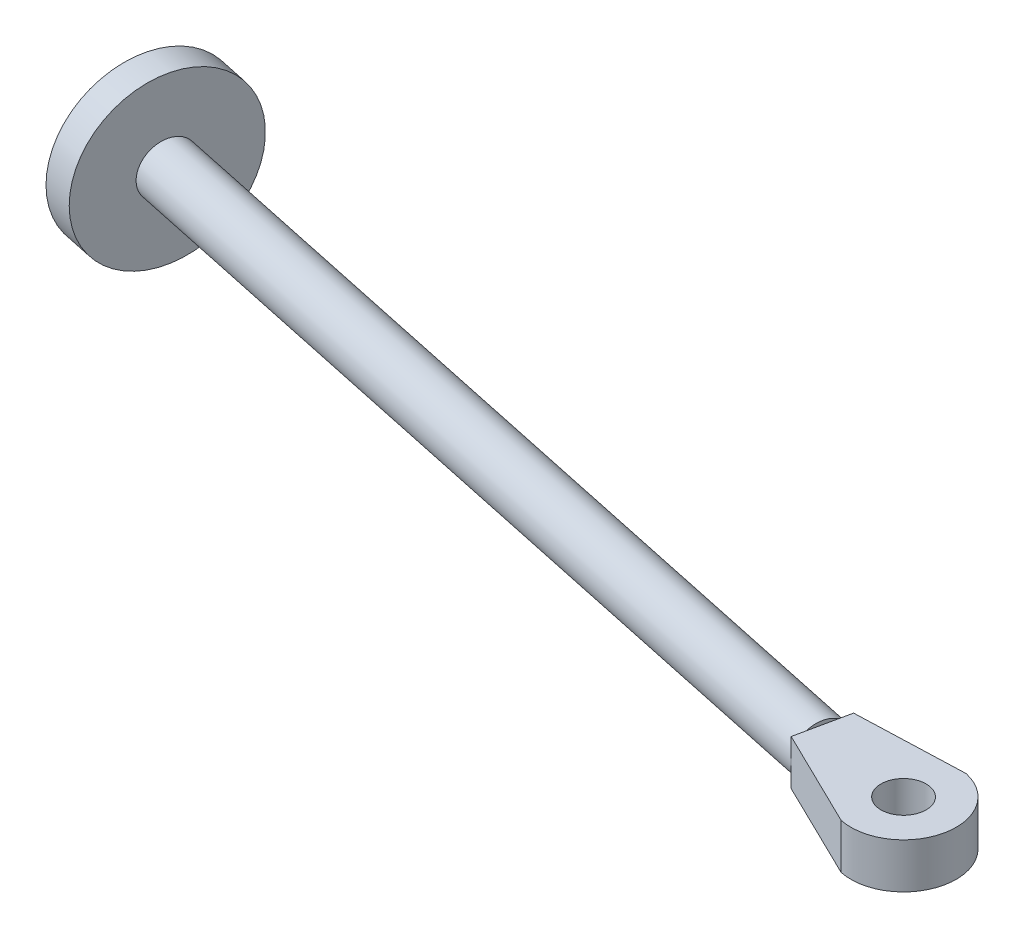
ISO-10303-21;
HEADER;
FILE_DESCRIPTION(('STEP AP214'),'2;1');
FILE_NAME('part.step','',(''),(''),'','','');
FILE_SCHEMA(('AUTOMOTIVE_DESIGN { 1 0 10303 214 1 1 1 1 }'));
ENDSEC;
DATA;
#1=APPLICATION_CONTEXT('core data for automotive mechanical design processes');
#2=APPLICATION_PROTOCOL_DEFINITION('international standard','automotive_design',2000,#1);
#3=PRODUCT_CONTEXT('',#1,'mechanical');
#4=PRODUCT('Part','Part','',(#3));
#5=PRODUCT_RELATED_PRODUCT_CATEGORY('part','',(#4));
#6=PRODUCT_DEFINITION_FORMATION('','',#4);
#7=PRODUCT_DEFINITION_CONTEXT('part definition',#1,'design');
#8=PRODUCT_DEFINITION('design','',#6,#7);
#9=PRODUCT_DEFINITION_SHAPE('','',#8);
#10=(LENGTH_UNIT() NAMED_UNIT(*) SI_UNIT(.MILLI.,.METRE.));
#11=(NAMED_UNIT(*) PLANE_ANGLE_UNIT() SI_UNIT($,.RADIAN.));
#12=(NAMED_UNIT(*) SI_UNIT($,.STERADIAN.) SOLID_ANGLE_UNIT());
#13=UNCERTAINTY_MEASURE_WITH_UNIT(LENGTH_MEASURE(1.E-05),#10,'distance_accuracy_value','');
#14=(GEOMETRIC_REPRESENTATION_CONTEXT(3) GLOBAL_UNCERTAINTY_ASSIGNED_CONTEXT((#13)) GLOBAL_UNIT_ASSIGNED_CONTEXT((#10,
#11,#12)) REPRESENTATION_CONTEXT('',''));
#15=CARTESIAN_POINT('',(0.,0.,0.));
#16=DIRECTION('',(0.,0.,1.));
#17=DIRECTION('',(1.,0.,0.));
#18=AXIS2_PLACEMENT_3D('',#15,#16,#17);
#19=CARTESIAN_POINT('',(-284.802016611491,47.,579.732584364979));
#20=DIRECTION('',(0.978229059050791,0.,0.207528089733903));
#21=DIRECTION('',(0.,-1.,0.));
#22=AXIS2_PLACEMENT_3D('',#19,#20,#21);
#23=CYLINDRICAL_SURFACE('',#22,17.5);
#24=CARTESIAN_POINT('',(253.223965866445,47.,693.873033718626));
#25=DIRECTION('',(-0.978229059050791,0.,-0.207528089733903));
#26=DIRECTION('',(0.,1.,0.));
#27=AXIS2_PLACEMENT_3D('',#24,#25,#26);
#28=CIRCLE('',#27,17.5);
#29=CARTESIAN_POINT('',(255.094598788031,62.,685.055396139735));
#30=VERTEX_POINT('',#29);
#31=CARTESIAN_POINT('',(256.855707436788,47.,676.754025185237));
#32=VERTEX_POINT('',#31);
#33=EDGE_CURVE('E63',#30,#32,#28,.T.);
#34=ORIENTED_EDGE('',*,*,#33,.T.);
#35=CARTESIAN_POINT('',(255.094598788031,31.9999999999996,685.055396139735));
#36=VERTEX_POINT('',#35);
#37=EDGE_CURVE('E134',#32,#36,#28,.T.);
#38=ORIENTED_EDGE('',*,*,#37,.T.);
#39=CARTESIAN_POINT('',(251.353332944858,31.9999999999996,702.690671297517));
#40=VERTEX_POINT('',#39);
#41=EDGE_CURVE('E210',#36,#40,#28,.T.);
#42=ORIENTED_EDGE('',*,*,#41,.T.);
#43=CARTESIAN_POINT('',(249.592224296102,47.,710.992042252015));
#44=VERTEX_POINT('',#43);
#45=EDGE_CURVE('E180',#40,#44,#28,.T.);
#46=ORIENTED_EDGE('',*,*,#45,.T.);
#47=CARTESIAN_POINT('',(251.353332944858,62.,702.690671297517));
#48=VERTEX_POINT('',#47);
#49=EDGE_CURVE('E208',#44,#48,#28,.T.);
#50=ORIENTED_EDGE('',*,*,#49,.T.);
#51=EDGE_CURVE('E136',#48,#30,#28,.T.);
#52=ORIENTED_EDGE('',*,*,#51,.T.);
#53=EDGE_LOOP('',(#34,#38,#42,#46,#50,#52));
#54=FACE_BOUND('',#53,.T.);
#55=CARTESIAN_POINT('',(-299.475452497253,47.,576.61966301897));
#56=DIRECTION('',(-0.978229059050791,0.,-0.207528089733903));
#57=DIRECTION('',(-0.207528089733903,0.,0.978229059050791));
#58=AXIS2_PLACEMENT_3D('',#55,#56,#57);
#59=CIRCLE('',#58,17.5);
#60=CARTESIAN_POINT('',(-303.107194067596,47.,593.738671552359));
#61=VERTEX_POINT('',#60);
#62=EDGE_CURVE('E42',#61,#61,#59,.T.);
#63=ORIENTED_EDGE('',*,*,#62,.F.);
#64=EDGE_LOOP('',(#63));
#65=FACE_BOUND('',#64,.T.);
#66=ADVANCED_FACE('F38',(#54,#65),#23,.T.);
#67=CARTESIAN_POINT('',(256.855707436788,62.,676.754025185237));
#68=DIRECTION('',(0.978229059050791,0.,0.207528089733903));
#69=DIRECTION('',(0.,-1.,0.));
#70=AXIS2_PLACEMENT_3D('',#67,#68,#69);
#71=PLANE('',#70);
#72=ORIENTED_EDGE('',*,*,#33,.F.);
#73=DIRECTION('',(-0.207528089733903,0.,0.978229059050791));
#74=VECTOR('',#73,1.);
#75=CARTESIAN_POINT('',(256.855707436788,62.,676.754025185237));
#76=LINE('',#75,#74);
#77=CARTESIAN_POINT('',(256.855707436788,62.,676.754025185237));
#78=VERTEX_POINT('',#77);
#79=EDGE_CURVE('E137',#78,#30,#76,.T.);
#80=ORIENTED_EDGE('',*,*,#79,.F.);
#81=DIRECTION('',(0.,-1.,0.));
#82=VECTOR('',#81,1.);
#83=CARTESIAN_POINT('',(256.855707436788,62.,676.754025185237));
#84=LINE('',#83,#82);
#85=EDGE_CURVE('E140',#78,#32,#84,.T.);
#86=ORIENTED_EDGE('',*,*,#85,.T.);
#87=EDGE_LOOP('',(#72,#80,#86));
#88=FACE_BOUND('',#87,.T.);
#89=ADVANCED_FACE('F166',(#88),#71,.F.);
#90=ORIENTED_EDGE('',*,*,#37,.F.);
#91=CARTESIAN_POINT('',(256.855707436788,31.9999999999996,676.754025185237));
#92=VERTEX_POINT('',#91);
#93=EDGE_CURVE('E143',#32,#92,#84,.T.);
#94=ORIENTED_EDGE('',*,*,#93,.T.);
#95=DIRECTION('',(-0.207528089733903,0.,0.978229059050791));
#96=VECTOR('',#95,1.);
#97=CARTESIAN_POINT('',(256.855707436788,31.9999999999996,676.754025185237));
#98=LINE('',#97,#96);
#99=EDGE_CURVE('E144',#92,#36,#98,.T.);
#100=ORIENTED_EDGE('',*,*,#99,.T.);
#101=EDGE_LOOP('',(#90,#94,#100));
#102=FACE_BOUND('',#101,.T.);
#103=ADVANCED_FACE('F189',(#102),#71,.F.);
#104=ORIENTED_EDGE('',*,*,#45,.F.);
#105=CARTESIAN_POINT('',(249.592224296102,31.9999999999996,710.992042252015));
#106=VERTEX_POINT('',#105);
#107=EDGE_CURVE('E147',#40,#106,#98,.T.);
#108=ORIENTED_EDGE('',*,*,#107,.T.);
#109=DIRECTION('',(0.,-1.,0.));
#110=VECTOR('',#109,1.);
#111=CARTESIAN_POINT('',(249.592224296102,62.,710.992042252015));
#112=LINE('',#111,#110);
#113=EDGE_CURVE('E55',#44,#106,#112,.T.);
#114=ORIENTED_EDGE('',*,*,#113,.F.);
#115=EDGE_LOOP('',(#104,#108,#114));
#116=FACE_BOUND('',#115,.T.);
#117=ADVANCED_FACE('F178',(#116),#71,.F.);
#118=ORIENTED_EDGE('',*,*,#49,.F.);
#119=CARTESIAN_POINT('',(249.592224296102,62.,710.992042252015));
#120=VERTEX_POINT('',#119);
#121=EDGE_CURVE('E150',#120,#44,#112,.T.);
#122=ORIENTED_EDGE('',*,*,#121,.F.);
#123=EDGE_CURVE('E124',#48,#120,#76,.T.);
#124=ORIENTED_EDGE('',*,*,#123,.F.);
#125=EDGE_LOOP('',(#118,#122,#124));
#126=FACE_BOUND('',#125,.T.);
#127=ADVANCED_FACE('F191',(#126),#71,.F.);
#128=CARTESIAN_POINT('',(321.7,62.,708.4));
#129=DIRECTION('',(0.,1.,0.));
#130=DIRECTION('',(0.978229059050791,0.,0.207528089733903));
#131=AXIS2_PLACEMENT_3D('',#128,#129,#130);
#132=PLANE('',#131);
#133=DIRECTION('',(0.999354540018559,0.,-0.0359235764407381));
#134=VECTOR('',#133,1.);
#135=CARTESIAN_POINT('',(256.855707436788,62.,676.754025185237));
#136=LINE('',#135,#134);
#137=CARTESIAN_POINT('',(328.963483140687,62.,674.161982933223));
#138=VERTEX_POINT('',#137);
#139=EDGE_CURVE('E109',#78,#138,#136,.T.);
#140=ORIENTED_EDGE('',*,*,#139,.F.);
#141=ORIENTED_EDGE('',*,*,#79,.T.);
#142=EDGE_CURVE('E141',#30,#48,#76,.T.);
#143=ORIENTED_EDGE('',*,*,#142,.T.);
#144=ORIENTED_EDGE('',*,*,#123,.T.);
#145=DIRECTION('',(-0.898688630106138,0.,-0.438587216090429));
#146=VECTOR('',#145,1.);
#147=CARTESIAN_POINT('',(249.592224296102,62.,710.992042252015));
#148=LINE('',#147,#146);
#149=CARTESIAN_POINT('',(314.436516859313,62.,742.638017066778));
#150=VERTEX_POINT('',#149);
#151=EDGE_CURVE('E103',#150,#120,#148,.T.);
#152=ORIENTED_EDGE('',*,*,#151,.F.);
#153=CARTESIAN_POINT('',(321.7,62.,708.4));
#154=DIRECTION('',(0.,-1.,0.));
#155=DIRECTION('',(0.,0.,1.));
#156=AXIS2_PLACEMENT_3D('',#153,#154,#155);
#157=CIRCLE('',#156,35.);
#158=EDGE_CURVE('E112',#138,#150,#157,.T.);
#159=ORIENTED_EDGE('',*,*,#158,.F.);
#160=EDGE_LOOP('',(#140,#141,#143,#144,#152,#159));
#161=FACE_BOUND('',#160,.T.);
#162=CARTESIAN_POINT('',(321.7,62.,708.4));
#163=DIRECTION('',(0.,1.,0.));
#164=DIRECTION('',(0.,0.,1.));
#165=AXIS2_PLACEMENT_3D('',#162,#163,#164);
#166=CIRCLE('',#165,15.);
#167=CARTESIAN_POINT('',(321.7,62.,723.4));
#168=VERTEX_POINT('',#167);
#169=EDGE_CURVE('E128',#168,#168,#166,.T.);
#170=ORIENTED_EDGE('',*,*,#169,.F.);
#171=EDGE_LOOP('',(#170));
#172=FACE_BOUND('',#171,.T.);
#173=ADVANCED_FACE('F120',(#161,#172),#132,.T.);
#174=CARTESIAN_POINT('',(321.7,31.9999999999995,708.4));
#175=DIRECTION('',(0.,1.,0.));
#176=DIRECTION('',(0.978229059050791,0.,0.207528089733903));
#177=AXIS2_PLACEMENT_3D('',#174,#175,#176);
#178=PLANE('',#177);
#179=CARTESIAN_POINT('',(321.7,31.9999999999995,708.4));
#180=DIRECTION('',(0.,1.,0.));
#181=DIRECTION('',(0.,0.,1.));
#182=AXIS2_PLACEMENT_3D('',#179,#180,#181);
#183=CIRCLE('',#182,15.);
#184=CARTESIAN_POINT('',(321.7,31.9999999999995,723.4));
#185=VERTEX_POINT('',#184);
#186=EDGE_CURVE('E132',#185,#185,#183,.T.);
#187=ORIENTED_EDGE('',*,*,#186,.T.);
#188=EDGE_LOOP('',(#187));
#189=FACE_BOUND('',#188,.T.);
#190=ORIENTED_EDGE('',*,*,#99,.F.);
#191=DIRECTION('',(0.99935454001856,0.,-0.0359235764407381));
#192=VECTOR('',#191,1.);
#193=CARTESIAN_POINT('',(320.480215410817,31.9999999999995,674.466929080518));
#194=LINE('',#193,#192);
#195=CARTESIAN_POINT('',(328.963483140687,31.9999999999996,674.161982933223));
#196=VERTEX_POINT('',#195);
#197=EDGE_CURVE('E13',#92,#196,#194,.T.);
#198=ORIENTED_EDGE('',*,*,#197,.T.);
#199=CARTESIAN_POINT('',(321.7,31.9999999999995,708.4));
#200=DIRECTION('',(0.,1.,0.));
#201=DIRECTION('',(0.,0.,1.));
#202=AXIS2_PLACEMENT_3D('',#199,#200,#201);
#203=CIRCLE('',#202,35.);
#204=CARTESIAN_POINT('',(314.436516859313,31.9999999999995,742.638017066778));
#205=VERTEX_POINT('',#204);
#206=EDGE_CURVE('E47',#196,#205,#203,.F.);
#207=ORIENTED_EDGE('',*,*,#206,.T.);
#208=DIRECTION('',(-0.898688630106138,0.,-0.438587216090429));
#209=VECTOR('',#208,1.);
#210=CARTESIAN_POINT('',(306.807776557759,31.9999999999995,738.914961206217));
#211=LINE('',#210,#209);
#212=EDGE_CURVE('E105',#205,#106,#211,.T.);
#213=ORIENTED_EDGE('',*,*,#212,.T.);
#214=ORIENTED_EDGE('',*,*,#107,.F.);
#215=EDGE_CURVE('E148',#36,#40,#98,.T.);
#216=ORIENTED_EDGE('',*,*,#215,.F.);
#217=EDGE_LOOP('',(#190,#198,#207,#213,#214,#216));
#218=FACE_BOUND('',#217,.T.);
#219=ADVANCED_FACE('F183',(#189,#218),#178,.F.);
#220=CARTESIAN_POINT('',(253.223965866445,47.,693.873033718626));
#221=DIRECTION('',(-0.978229059050791,0.,-0.207528089733903));
#222=DIRECTION('',(0.,1.,0.));
#223=AXIS2_PLACEMENT_3D('',#220,#221,#222);
#224=PLANE('',#223);
#225=ORIENTED_EDGE('',*,*,#41,.F.);
#226=ORIENTED_EDGE('',*,*,#215,.T.);
#227=EDGE_LOOP('',(#225,#226));
#228=FACE_BOUND('',#227,.T.);
#229=ADVANCED_FACE('F212',(#228),#224,.F.);
#230=ORIENTED_EDGE('',*,*,#142,.F.);
#231=ORIENTED_EDGE('',*,*,#51,.F.);
#232=EDGE_LOOP('',(#230,#231));
#233=FACE_BOUND('',#232,.T.);
#234=ADVANCED_FACE('F165',(#233),#224,.F.);
#235=CARTESIAN_POINT('',(-299.475452497253,47.,576.61966301897));
#236=DIRECTION('',(-0.978229059050791,0.,-0.207528089733903));
#237=DIRECTION('',(-0.207528089733903,0.,0.978229059050791));
#238=AXIS2_PLACEMENT_3D('',#235,#236,#237);
#239=PLANE('',#238);
#240=CARTESIAN_POINT('',(-299.475452497253,47.,576.61966301897));
#241=DIRECTION('',(-0.978229059050791,0.,-0.207528089733903));
#242=DIRECTION('',(-0.207528089733903,0.,0.978229059050791));
#243=AXIS2_PLACEMENT_3D('',#240,#241,#242);
#244=CIRCLE('',#243,55.);
#245=CARTESIAN_POINT('',(-310.889497432618,47.,630.422261266764));
#246=VERTEX_POINT('',#245);
#247=EDGE_CURVE('E135',#246,#246,#244,.T.);
#248=ORIENTED_EDGE('',*,*,#247,.F.);
#249=EDGE_LOOP('',(#248));
#250=FACE_BOUND('',#249,.T.);
#251=ORIENTED_EDGE('',*,*,#62,.T.);
#252=EDGE_LOOP('',(#251));
#253=FACE_BOUND('',#252,.T.);
#254=ADVANCED_FACE('F40',(#250,#253),#239,.F.);
#255=CARTESIAN_POINT('',(-275.019726020983,47.,581.807865262318));
#256=DIRECTION('',(-0.978229059050792,0.,-0.207528089733903));
#257=DIRECTION('',(-0.207528089733903,0.,0.978229059050792));
#258=AXIS2_PLACEMENT_3D('',#255,#256,#257);
#259=CYLINDRICAL_SURFACE('',#258,55.);
#260=ORIENTED_EDGE('',*,*,#247,.T.);
#261=EDGE_LOOP('',(#260));
#262=FACE_BOUND('',#261,.T.);
#263=CARTESIAN_POINT('',(-319.040033678269,47.,572.469101224292));
#264=DIRECTION('',(-0.978229059050791,0.,-0.207528089733903));
#265=DIRECTION('',(-0.207528089733903,0.,0.978229059050791));
#266=AXIS2_PLACEMENT_3D('',#263,#264,#265);
#267=CIRCLE('',#266,55.);
#268=CARTESIAN_POINT('',(-330.454078613633,47.,626.271699472086));
#269=VERTEX_POINT('',#268);
#270=EDGE_CURVE('E153',#269,#269,#267,.T.);
#271=ORIENTED_EDGE('',*,*,#270,.F.);
#272=EDGE_LOOP('',(#271));
#273=FACE_BOUND('',#272,.T.);
#274=ADVANCED_FACE('F160',(#262,#273),#259,.T.);
#275=CARTESIAN_POINT('',(-319.040033678269,47.,572.469101224292));
#276=DIRECTION('',(-0.978229059050791,0.,-0.207528089733903));
#277=DIRECTION('',(0.,1.,0.));
#278=AXIS2_PLACEMENT_3D('',#275,#276,#277);
#279=PLANE('',#278);
#280=ORIENTED_EDGE('',*,*,#270,.T.);
#281=EDGE_LOOP('',(#280));
#282=FACE_BOUND('',#281,.T.);
#283=ADVANCED_FACE('F222',(#282),#279,.T.);
#284=CARTESIAN_POINT('',(321.7,-8.00000000000042,708.4));
#285=DIRECTION('',(0.,1.,0.));
#286=DIRECTION('',(0.,0.,1.));
#287=AXIS2_PLACEMENT_3D('',#284,#285,#286);
#288=CYLINDRICAL_SURFACE('',#287,15.);
#289=ORIENTED_EDGE('',*,*,#169,.T.);
#290=EDGE_LOOP('',(#289));
#291=FACE_BOUND('',#290,.T.);
#292=ORIENTED_EDGE('',*,*,#186,.F.);
#293=EDGE_LOOP('',(#292));
#294=FACE_BOUND('',#293,.T.);
#295=ADVANCED_FACE('F224',(#291,#294),#288,.F.);
#296=CARTESIAN_POINT('',(321.7,-8.00000000000042,708.4));
#297=DIRECTION('',(0.,1.,0.));
#298=DIRECTION('',(0.,0.,1.));
#299=AXIS2_PLACEMENT_3D('',#296,#297,#298);
#300=CYLINDRICAL_SURFACE('',#299,35.);
#301=DIRECTION('',(0.,1.,0.));
#302=VECTOR('',#301,1.);
#303=CARTESIAN_POINT('',(328.963483140687,-8.0000000000004,674.161982933223));
#304=LINE('',#303,#302);
#305=EDGE_CURVE('E108',#196,#138,#304,.T.);
#306=ORIENTED_EDGE('',*,*,#305,.T.);
#307=ORIENTED_EDGE('',*,*,#158,.T.);
#308=DIRECTION('',(0.,1.,0.));
#309=VECTOR('',#308,1.);
#310=CARTESIAN_POINT('',(314.436516859313,-8.00000000000043,742.638017066778));
#311=LINE('',#310,#309);
#312=EDGE_CURVE('E99',#205,#150,#311,.T.);
#313=ORIENTED_EDGE('',*,*,#312,.F.);
#314=ORIENTED_EDGE('',*,*,#206,.F.);
#315=EDGE_LOOP('',(#306,#307,#313,#314));
#316=FACE_BOUND('',#315,.T.);
#317=ADVANCED_FACE('F113',(#316),#300,.T.);
#318=CARTESIAN_POINT('',(256.855707436788,-8.00000000000038,676.754025185237));
#319=DIRECTION('',(0.0359235764407381,0.,0.999354540018559));
#320=DIRECTION('',(0.999354540018559,0.,-0.0359235764407381));
#321=AXIS2_PLACEMENT_3D('',#318,#319,#320);
#322=PLANE('',#321);
#323=ORIENTED_EDGE('',*,*,#93,.F.);
#324=ORIENTED_EDGE('',*,*,#85,.F.);
#325=ORIENTED_EDGE('',*,*,#139,.T.);
#326=ORIENTED_EDGE('',*,*,#305,.F.);
#327=ORIENTED_EDGE('',*,*,#197,.F.);
#328=EDGE_LOOP('',(#323,#324,#325,#326,#327));
#329=FACE_BOUND('',#328,.T.);
#330=ADVANCED_FACE('F185',(#329),#322,.F.);
#331=CARTESIAN_POINT('',(249.592224296102,-8.00000000000039,710.992042252015));
#332=DIRECTION('',(0.438587216090429,0.,-0.898688630106138));
#333=DIRECTION('',(-0.898688630106138,0.,-0.438587216090429));
#334=AXIS2_PLACEMENT_3D('',#331,#332,#333);
#335=PLANE('',#334);
#336=ORIENTED_EDGE('',*,*,#312,.T.);
#337=ORIENTED_EDGE('',*,*,#151,.T.);
#338=ORIENTED_EDGE('',*,*,#121,.T.);
#339=ORIENTED_EDGE('',*,*,#113,.T.);
#340=ORIENTED_EDGE('',*,*,#212,.F.);
#341=EDGE_LOOP('',(#336,#337,#338,#339,#340));
#342=FACE_BOUND('',#341,.T.);
#343=ADVANCED_FACE('F101',(#342),#335,.F.);
#344=CLOSED_SHELL('',(#66,#89,#103,#117,#127,#173,#219,#229,#234,#254,#274,#283,#295,#317,#330,#343));
#345=MANIFOLD_SOLID_BREP('B2',#344);
#346=ADVANCED_BREP_SHAPE_REPRESENTATION('',(#18,#345),#14);
#347=SHAPE_DEFINITION_REPRESENTATION(#9,#346);
ENDSEC;
END-ISO-10303-21;
